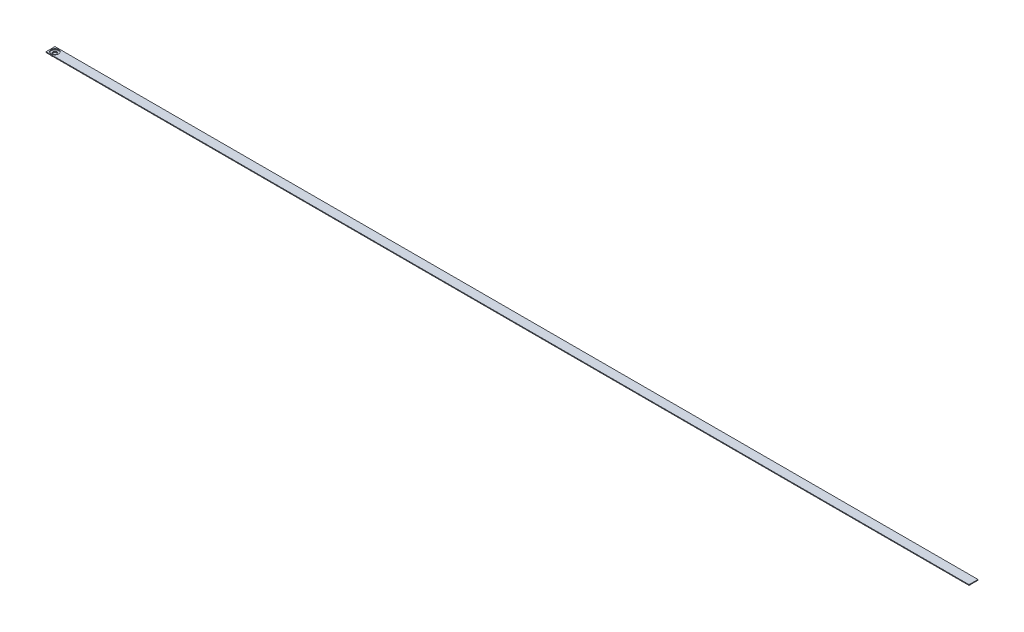
ISO-10303-21;
HEADER;
FILE_DESCRIPTION(('STEP AP214'),'2;1');
FILE_NAME('part.step','',(''),(''),'','','');
FILE_SCHEMA(('AUTOMOTIVE_DESIGN { 1 0 10303 214 1 1 1 1 }'));
ENDSEC;
DATA;
#1=APPLICATION_CONTEXT('core data for automotive mechanical design processes');
#2=APPLICATION_PROTOCOL_DEFINITION('international standard','automotive_design',2000,#1);
#3=PRODUCT_CONTEXT('',#1,'mechanical');
#4=PRODUCT('Part','Part','',(#3));
#5=PRODUCT_RELATED_PRODUCT_CATEGORY('part','',(#4));
#6=PRODUCT_DEFINITION_FORMATION('','',#4);
#7=PRODUCT_DEFINITION_CONTEXT('part definition',#1,'design');
#8=PRODUCT_DEFINITION('design','',#6,#7);
#9=PRODUCT_DEFINITION_SHAPE('','',#8);
#10=(LENGTH_UNIT() NAMED_UNIT(*) SI_UNIT(.MILLI.,.METRE.));
#11=(NAMED_UNIT(*) PLANE_ANGLE_UNIT() SI_UNIT($,.RADIAN.));
#12=(NAMED_UNIT(*) SI_UNIT($,.STERADIAN.) SOLID_ANGLE_UNIT());
#13=UNCERTAINTY_MEASURE_WITH_UNIT(LENGTH_MEASURE(1.E-05),#10,'distance_accuracy_value','');
#14=(GEOMETRIC_REPRESENTATION_CONTEXT(3) GLOBAL_UNCERTAINTY_ASSIGNED_CONTEXT((#13)) GLOBAL_UNIT_ASSIGNED_CONTEXT((#10,
#11,#12)) REPRESENTATION_CONTEXT('',''));
#15=CARTESIAN_POINT('',(0.,0.,0.));
#16=DIRECTION('',(0.,0.,1.));
#17=DIRECTION('',(1.,0.,0.));
#18=AXIS2_PLACEMENT_3D('',#15,#16,#17);
#19=CARTESIAN_POINT('',(-1213.09999999999,-4.65,0.));
#20=DIRECTION('',(0.,-1.,0.));
#21=DIRECTION('',(0.,0.,-1.));
#22=AXIS2_PLACEMENT_3D('',#19,#20,#21);
#23=CYLINDRICAL_SURFACE('',#22,5.25000000000006);
#24=CARTESIAN_POINT('',(-1213.09999999999,-4.65,0.));
#25=DIRECTION('',(0.,1.,0.));
#26=DIRECTION('',(0.,0.,1.));
#27=AXIS2_PLACEMENT_3D('',#24,#25,#26);
#28=CIRCLE('',#27,5.25000000000006);
#29=CARTESIAN_POINT('',(-1213.09999999999,-4.65,-5.25000000000006));
#30=VERTEX_POINT('',#29);
#31=EDGE_CURVE('E11',#30,#30,#28,.T.);
#32=CARTESIAN_POINT('',(-1213.09999999999,-6.55,0.));
#33=DIRECTION('',(0.,1.,0.));
#34=DIRECTION('',(0.,0.,1.));
#35=AXIS2_PLACEMENT_3D('',#32,#33,#34);
#36=CIRCLE('',#35,5.25000000000006);
#37=CARTESIAN_POINT('',(-1213.09999999999,-6.55,-5.25000000000006));
#38=VERTEX_POINT('',#37);
#39=EDGE_CURVE('E51',#38,#38,#36,.T.);
#40=CARTESIAN_POINT('',(-1213.09999999999,-4.65,-5.25000000000006));
#41=CARTESIAN_POINT('',(-1213.09999999999,-4.66979166666667,-5.25000000000006));
#42=CARTESIAN_POINT('',(-1213.09999999999,-4.68958333333333,-5.25000000000006));
#43=CARTESIAN_POINT('',(-1213.09999999999,-4.72916666666667,-5.25000000000006));
#44=CARTESIAN_POINT('',(-1213.09999999999,-4.74895833333333,-5.25000000000006));
#45=CARTESIAN_POINT('',(-1213.09999999999,-4.78854166666667,-5.25000000000006));
#46=CARTESIAN_POINT('',(-1213.09999999999,-4.80833333333333,-5.25000000000006));
#47=CARTESIAN_POINT('',(-1213.09999999999,-4.84791666666667,-5.25000000000006));
#48=CARTESIAN_POINT('',(-1213.09999999999,-4.86770833333333,-5.25000000000006));
#49=CARTESIAN_POINT('',(-1213.09999999999,-4.90729166666667,-5.25000000000006));
#50=CARTESIAN_POINT('',(-1213.09999999999,-4.92708333333333,-5.25000000000006));
#51=CARTESIAN_POINT('',(-1213.09999999999,-4.96666666666667,-5.25000000000006));
#52=CARTESIAN_POINT('',(-1213.09999999999,-4.98645833333333,-5.25000000000006));
#53=CARTESIAN_POINT('',(-1213.09999999999,-5.02604166666667,-5.25000000000006));
#54=CARTESIAN_POINT('',(-1213.09999999999,-5.04583333333333,-5.25000000000006));
#55=CARTESIAN_POINT('',(-1213.09999999999,-5.08541666666667,-5.25000000000006));
#56=CARTESIAN_POINT('',(-1213.09999999999,-5.10520833333333,-5.25000000000006));
#57=CARTESIAN_POINT('',(-1213.09999999999,-5.14479166666667,-5.25000000000006));
#58=CARTESIAN_POINT('',(-1213.09999999999,-5.16458333333333,-5.25000000000006));
#59=CARTESIAN_POINT('',(-1213.09999999999,-5.20416666666667,-5.25000000000006));
#60=CARTESIAN_POINT('',(-1213.09999999999,-5.22395833333333,-5.25000000000006));
#61=CARTESIAN_POINT('',(-1213.09999999999,-5.26354166666667,-5.25000000000006));
#62=CARTESIAN_POINT('',(-1213.09999999999,-5.28333333333333,-5.25000000000006));
#63=CARTESIAN_POINT('',(-1213.09999999999,-5.32291666666667,-5.25000000000006));
#64=CARTESIAN_POINT('',(-1213.09999999999,-5.34270833333333,-5.25000000000006));
#65=CARTESIAN_POINT('',(-1213.09999999999,-5.38229166666667,-5.25000000000006));
#66=CARTESIAN_POINT('',(-1213.09999999999,-5.40208333333333,-5.25000000000006));
#67=CARTESIAN_POINT('',(-1213.09999999999,-5.44166666666667,-5.25000000000006));
#68=CARTESIAN_POINT('',(-1213.09999999999,-5.46145833333333,-5.25000000000006));
#69=CARTESIAN_POINT('',(-1213.09999999999,-5.50104166666667,-5.25000000000006));
#70=CARTESIAN_POINT('',(-1213.09999999999,-5.52083333333333,-5.25000000000006));
#71=CARTESIAN_POINT('',(-1213.09999999999,-5.56041666666667,-5.25000000000006));
#72=CARTESIAN_POINT('',(-1213.09999999999,-5.58020833333333,-5.25000000000006));
#73=CARTESIAN_POINT('',(-1213.09999999999,-5.61979166666667,-5.25000000000006));
#74=CARTESIAN_POINT('',(-1213.09999999999,-5.63958333333333,-5.25000000000006));
#75=CARTESIAN_POINT('',(-1213.09999999999,-5.67916666666667,-5.25000000000006));
#76=CARTESIAN_POINT('',(-1213.09999999999,-5.69895833333333,-5.25000000000006));
#77=CARTESIAN_POINT('',(-1213.09999999999,-5.73854166666667,-5.25000000000006));
#78=CARTESIAN_POINT('',(-1213.09999999999,-5.75833333333333,-5.25000000000006));
#79=CARTESIAN_POINT('',(-1213.09999999999,-5.79791666666667,-5.25000000000006));
#80=CARTESIAN_POINT('',(-1213.09999999999,-5.81770833333333,-5.25000000000006));
#81=CARTESIAN_POINT('',(-1213.09999999999,-5.85729166666667,-5.25000000000006));
#82=CARTESIAN_POINT('',(-1213.09999999999,-5.87708333333333,-5.25000000000006));
#83=CARTESIAN_POINT('',(-1213.09999999999,-5.91666666666667,-5.25000000000006));
#84=CARTESIAN_POINT('',(-1213.09999999999,-5.93645833333333,-5.25000000000006));
#85=CARTESIAN_POINT('',(-1213.09999999999,-5.97604166666667,-5.25000000000006));
#86=CARTESIAN_POINT('',(-1213.09999999999,-5.99583333333333,-5.25000000000006));
#87=CARTESIAN_POINT('',(-1213.09999999999,-6.03541666666667,-5.25000000000006));
#88=CARTESIAN_POINT('',(-1213.09999999999,-6.05520833333333,-5.25000000000006));
#89=CARTESIAN_POINT('',(-1213.09999999999,-6.09479166666667,-5.25000000000006));
#90=CARTESIAN_POINT('',(-1213.09999999999,-6.11458333333333,-5.25000000000006));
#91=CARTESIAN_POINT('',(-1213.09999999999,-6.15416666666667,-5.25000000000006));
#92=CARTESIAN_POINT('',(-1213.09999999999,-6.17395833333333,-5.25000000000006));
#93=CARTESIAN_POINT('',(-1213.09999999999,-6.21354166666667,-5.25000000000006));
#94=CARTESIAN_POINT('',(-1213.09999999999,-6.23333333333333,-5.25000000000006));
#95=CARTESIAN_POINT('',(-1213.09999999999,-6.27291666666667,-5.25000000000006));
#96=CARTESIAN_POINT('',(-1213.09999999999,-6.29270833333333,-5.25000000000006));
#97=CARTESIAN_POINT('',(-1213.09999999999,-6.33229166666667,-5.25000000000006));
#98=CARTESIAN_POINT('',(-1213.09999999999,-6.35208333333333,-5.25000000000006));
#99=CARTESIAN_POINT('',(-1213.09999999999,-6.39166666666667,-5.25000000000006));
#100=CARTESIAN_POINT('',(-1213.09999999999,-6.41145833333333,-5.25000000000006));
#101=CARTESIAN_POINT('',(-1213.09999999999,-6.45104166666667,-5.25000000000006));
#102=CARTESIAN_POINT('',(-1213.09999999999,-6.47083333333333,-5.25000000000006));
#103=CARTESIAN_POINT('',(-1213.09999999999,-6.51041666666667,-5.25000000000006));
#104=CARTESIAN_POINT('',(-1213.09999999999,-6.53020833333333,-5.25000000000006));
#105=CARTESIAN_POINT('',(-1213.09999999999,-6.55,-5.25000000000006));
#106=B_SPLINE_CURVE_WITH_KNOTS('',3,(#40,#41,#42,#43,#44,#45,#46,#47,#48,#49,#50,#51,#52,#53,
#54,#55,#56,#57,#58,#59,#60,#61,#62,#63,#64,#65,#66,#67,#68,#69,#70,#71,#72,#73,#74,#75,#76,#77,
#78,#79,#80,#81,#82,#83,#84,#85,#86,#87,#88,#89,#90,#91,#92,#93,#94,#95,#96,#97,#98,#99,#100,
#101,#102,#103,#104,#105),.UNSPECIFIED.,.F.,.F.,(4,2,2,2,2,2,2,2,2,2,2,2,2,2,2,2,2,2,2,2,2,2,2,
2,2,2,2,2,2,2,2,2,4),(0.,0.0593749999999995,0.11875,0.178124999999999,0.2375,0.296874999999999,
0.35625,0.415624999999999,0.475,0.534374999999999,0.59375,0.653124999999999,0.7125,0.771875,
0.831249999999999,0.890625,0.95,1.009375,1.06875,1.128125,1.1875,1.246875,1.30625,1.365625,
1.425,1.484375,1.54375,1.603125,1.6625,1.721875,1.78125,1.840625,1.9),.UNSPECIFIED.);
#107=EDGE_CURVE('BSEAM48',#30,#38,#106,.T.);
#108=ORIENTED_EDGE('',*,*,#31,.F.);
#109=ORIENTED_EDGE('',*,*,#39,.T.);
#110=ORIENTED_EDGE('',*,*,#107,.T.);
#111=ORIENTED_EDGE('',*,*,#107,.F.);
#112=EDGE_LOOP('',(#108,#110,#109,#111));
#113=FACE_BOUND('',#112,.T.);
#114=ADVANCED_FACE('F48',(#113),#23,.T.);
#115=CARTESIAN_POINT('',(-1213.09999999999,-4.65,0.));
#116=DIRECTION('',(0.,1.,0.));
#117=DIRECTION('',(0.,0.,1.));
#118=AXIS2_PLACEMENT_3D('',#115,#116,#117);
#119=PLANE('',#118);
#120=ORIENTED_EDGE('',*,*,#31,.T.);
#121=EDGE_LOOP('',(#120));
#122=FACE_BOUND('',#121,.T.);
#123=ADVANCED_FACE('F63',(#122),#119,.T.);
#124=CARTESIAN_POINT('',(-1213.09999999999,-6.55,0.));
#125=DIRECTION('',(0.,1.,0.));
#126=DIRECTION('',(0.,0.,1.));
#127=AXIS2_PLACEMENT_3D('',#124,#125,#126);
#128=PLANE('',#127);
#129=ORIENTED_EDGE('',*,*,#39,.F.);
#130=EDGE_LOOP('',(#129));
#131=FACE_BOUND('',#130,.T.);
#132=ADVANCED_FACE('F61',(#131),#128,.F.);
#133=CLOSED_SHELL('',(#114,#123,#132));
#134=MANIFOLD_SOLID_BREP('B2',#133);
#135=CARTESIAN_POINT('',(-1213.09999999999,-1.85,0.));
#136=DIRECTION('',(0.,1.,0.));
#137=DIRECTION('',(0.,0.,1.));
#138=AXIS2_PLACEMENT_3D('',#135,#136,#137);
#139=PLANE('',#138);
#140=CARTESIAN_POINT('',(-1213.09999999999,-1.85,0.));
#141=DIRECTION('',(0.,1.,0.));
#142=DIRECTION('',(0.,0.,1.));
#143=AXIS2_PLACEMENT_3D('',#140,#141,#142);
#144=CIRCLE('',#143,10.0000000000001);
#145=CARTESIAN_POINT('',(-1213.09999999999,-1.85,-10.0000000000001));
#146=VERTEX_POINT('',#145);
#147=EDGE_CURVE('E47',#146,#146,#144,.T.);
#148=ORIENTED_EDGE('',*,*,#147,.T.);
#149=EDGE_LOOP('',(#148));
#150=FACE_BOUND('',#149,.T.);
#151=CARTESIAN_POINT('',(-1213.09999999999,-1.85,0.));
#152=DIRECTION('',(0.,1.,0.));
#153=DIRECTION('',(0.,0.,1.));
#154=AXIS2_PLACEMENT_3D('',#151,#152,#153);
#155=CIRCLE('',#154,5.25000000000005);
#156=CARTESIAN_POINT('',(-1213.09999999999,-1.85,-5.25000000000005));
#157=VERTEX_POINT('',#156);
#158=EDGE_CURVE('E109',#157,#157,#155,.T.);
#159=ORIENTED_EDGE('',*,*,#158,.F.);
#160=EDGE_LOOP('',(#159));
#161=FACE_BOUND('',#160,.T.);
#162=ADVANCED_FACE('F98',(#150,#161),#139,.T.);
#163=CARTESIAN_POINT('',(-1213.09999999999,-3.75,0.));
#164=DIRECTION('',(0.,1.,0.));
#165=DIRECTION('',(0.,0.,1.));
#166=AXIS2_PLACEMENT_3D('',#163,#164,#165);
#167=PLANE('',#166);
#168=CARTESIAN_POINT('',(-1213.09999999999,-3.75,0.));
#169=DIRECTION('',(0.,1.,0.));
#170=DIRECTION('',(0.,0.,1.));
#171=AXIS2_PLACEMENT_3D('',#168,#169,#170);
#172=CIRCLE('',#171,10.0000000000001);
#173=CARTESIAN_POINT('',(-1213.09999999999,-3.75,-10.0000000000001));
#174=VERTEX_POINT('',#173);
#175=EDGE_CURVE('E102',#174,#174,#172,.T.);
#176=ORIENTED_EDGE('',*,*,#175,.F.);
#177=EDGE_LOOP('',(#176));
#178=FACE_BOUND('',#177,.T.);
#179=CARTESIAN_POINT('',(-1213.09999999999,-3.75,0.));
#180=DIRECTION('',(0.,1.,0.));
#181=DIRECTION('',(0.,0.,1.));
#182=AXIS2_PLACEMENT_3D('',#179,#180,#181);
#183=CIRCLE('',#182,5.25000000000005);
#184=CARTESIAN_POINT('',(-1213.09999999999,-3.75,-5.25000000000005));
#185=VERTEX_POINT('',#184);
#186=EDGE_CURVE('E111',#185,#185,#183,.T.);
#187=ORIENTED_EDGE('',*,*,#186,.T.);
#188=EDGE_LOOP('',(#187));
#189=FACE_BOUND('',#188,.T.);
#190=ADVANCED_FACE('F121',(#178,#189),#167,.F.);
#191=CARTESIAN_POINT('',(-1213.09999999999,-1.85,0.));
#192=DIRECTION('',(0.,-1.,0.));
#193=DIRECTION('',(0.,0.,-1.));
#194=AXIS2_PLACEMENT_3D('',#191,#192,#193);
#195=CYLINDRICAL_SURFACE('',#194,10.0000000000001);
#196=CARTESIAN_POINT('',(-1213.09999999999,-1.85,-10.0000000000001));
#197=CARTESIAN_POINT('',(-1213.09999999999,-1.86979166666667,-10.0000000000001));
#198=CARTESIAN_POINT('',(-1213.09999999999,-1.88958333333333,-10.0000000000001));
#199=CARTESIAN_POINT('',(-1213.09999999999,-1.92916666666667,-10.0000000000001));
#200=CARTESIAN_POINT('',(-1213.09999999999,-1.94895833333333,-10.0000000000001));
#201=CARTESIAN_POINT('',(-1213.09999999999,-1.98854166666667,-10.0000000000001));
#202=CARTESIAN_POINT('',(-1213.09999999999,-2.00833333333333,-10.0000000000001));
#203=CARTESIAN_POINT('',(-1213.09999999999,-2.04791666666667,-10.0000000000001));
#204=CARTESIAN_POINT('',(-1213.09999999999,-2.06770833333333,-10.0000000000001));
#205=CARTESIAN_POINT('',(-1213.09999999999,-2.10729166666667,-10.0000000000001));
#206=CARTESIAN_POINT('',(-1213.09999999999,-2.12708333333333,-10.0000000000001));
#207=CARTESIAN_POINT('',(-1213.09999999999,-2.16666666666667,-10.0000000000001));
#208=CARTESIAN_POINT('',(-1213.09999999999,-2.18645833333333,-10.0000000000001));
#209=CARTESIAN_POINT('',(-1213.09999999999,-2.22604166666667,-10.0000000000001));
#210=CARTESIAN_POINT('',(-1213.09999999999,-2.24583333333333,-10.0000000000001));
#211=CARTESIAN_POINT('',(-1213.09999999999,-2.28541666666667,-10.0000000000001));
#212=CARTESIAN_POINT('',(-1213.09999999999,-2.30520833333333,-10.0000000000001));
#213=CARTESIAN_POINT('',(-1213.09999999999,-2.34479166666667,-10.0000000000001));
#214=CARTESIAN_POINT('',(-1213.09999999999,-2.36458333333333,-10.0000000000001));
#215=CARTESIAN_POINT('',(-1213.09999999999,-2.40416666666667,-10.0000000000001));
#216=CARTESIAN_POINT('',(-1213.09999999999,-2.42395833333333,-10.0000000000001));
#217=CARTESIAN_POINT('',(-1213.09999999999,-2.46354166666667,-10.0000000000001));
#218=CARTESIAN_POINT('',(-1213.09999999999,-2.48333333333333,-10.0000000000001));
#219=CARTESIAN_POINT('',(-1213.09999999999,-2.52291666666667,-10.0000000000001));
#220=CARTESIAN_POINT('',(-1213.09999999999,-2.54270833333333,-10.0000000000001));
#221=CARTESIAN_POINT('',(-1213.09999999999,-2.58229166666667,-10.0000000000001));
#222=CARTESIAN_POINT('',(-1213.09999999999,-2.60208333333333,-10.0000000000001));
#223=CARTESIAN_POINT('',(-1213.09999999999,-2.64166666666667,-10.0000000000001));
#224=CARTESIAN_POINT('',(-1213.09999999999,-2.66145833333333,-10.0000000000001));
#225=CARTESIAN_POINT('',(-1213.09999999999,-2.70104166666667,-10.0000000000001));
#226=CARTESIAN_POINT('',(-1213.09999999999,-2.72083333333333,-10.0000000000001));
#227=CARTESIAN_POINT('',(-1213.09999999999,-2.76041666666667,-10.0000000000001));
#228=CARTESIAN_POINT('',(-1213.09999999999,-2.78020833333333,-10.0000000000001));
#229=CARTESIAN_POINT('',(-1213.09999999999,-2.81979166666667,-10.0000000000001));
#230=CARTESIAN_POINT('',(-1213.09999999999,-2.83958333333333,-10.0000000000001));
#231=CARTESIAN_POINT('',(-1213.09999999999,-2.87916666666667,-10.0000000000001));
#232=CARTESIAN_POINT('',(-1213.09999999999,-2.89895833333333,-10.0000000000001));
#233=CARTESIAN_POINT('',(-1213.09999999999,-2.93854166666667,-10.0000000000001));
#234=CARTESIAN_POINT('',(-1213.09999999999,-2.95833333333333,-10.0000000000001));
#235=CARTESIAN_POINT('',(-1213.09999999999,-2.99791666666667,-10.0000000000001));
#236=CARTESIAN_POINT('',(-1213.09999999999,-3.01770833333333,-10.0000000000001));
#237=CARTESIAN_POINT('',(-1213.09999999999,-3.05729166666667,-10.0000000000001));
#238=CARTESIAN_POINT('',(-1213.09999999999,-3.07708333333333,-10.0000000000001));
#239=CARTESIAN_POINT('',(-1213.09999999999,-3.11666666666667,-10.0000000000001));
#240=CARTESIAN_POINT('',(-1213.09999999999,-3.13645833333333,-10.0000000000001));
#241=CARTESIAN_POINT('',(-1213.09999999999,-3.17604166666667,-10.0000000000001));
#242=CARTESIAN_POINT('',(-1213.09999999999,-3.19583333333333,-10.0000000000001));
#243=CARTESIAN_POINT('',(-1213.09999999999,-3.23541666666667,-10.0000000000001));
#244=CARTESIAN_POINT('',(-1213.09999999999,-3.25520833333333,-10.0000000000001));
#245=CARTESIAN_POINT('',(-1213.09999999999,-3.29479166666667,-10.0000000000001));
#246=CARTESIAN_POINT('',(-1213.09999999999,-3.31458333333333,-10.0000000000001));
#247=CARTESIAN_POINT('',(-1213.09999999999,-3.35416666666667,-10.0000000000001));
#248=CARTESIAN_POINT('',(-1213.09999999999,-3.37395833333333,-10.0000000000001));
#249=CARTESIAN_POINT('',(-1213.09999999999,-3.41354166666667,-10.0000000000001));
#250=CARTESIAN_POINT('',(-1213.09999999999,-3.43333333333333,-10.0000000000001));
#251=CARTESIAN_POINT('',(-1213.09999999999,-3.47291666666667,-10.0000000000001));
#252=CARTESIAN_POINT('',(-1213.09999999999,-3.49270833333333,-10.0000000000001));
#253=CARTESIAN_POINT('',(-1213.09999999999,-3.53229166666667,-10.0000000000001));
#254=CARTESIAN_POINT('',(-1213.09999999999,-3.55208333333333,-10.0000000000001));
#255=CARTESIAN_POINT('',(-1213.09999999999,-3.59166666666667,-10.0000000000001));
#256=CARTESIAN_POINT('',(-1213.09999999999,-3.61145833333333,-10.0000000000001));
#257=CARTESIAN_POINT('',(-1213.09999999999,-3.65104166666667,-10.0000000000001));
#258=CARTESIAN_POINT('',(-1213.09999999999,-3.67083333333333,-10.0000000000001));
#259=CARTESIAN_POINT('',(-1213.09999999999,-3.71041666666667,-10.0000000000001));
#260=CARTESIAN_POINT('',(-1213.09999999999,-3.73020833333333,-10.0000000000001));
#261=CARTESIAN_POINT('',(-1213.09999999999,-3.75,-10.0000000000001));
#262=B_SPLINE_CURVE_WITH_KNOTS('',3,(#196,#197,#198,#199,#200,#201,#202,#203,#204,#205,#206,
#207,#208,#209,#210,#211,#212,#213,#214,#215,#216,#217,#218,#219,#220,#221,#222,#223,#224,#225,
#226,#227,#228,#229,#230,#231,#232,#233,#234,#235,#236,#237,#238,#239,#240,#241,#242,#243,#244,
#245,#246,#247,#248,#249,#250,#251,#252,#253,#254,#255,#256,#257,#258,#259,#260,#261),
.UNSPECIFIED.,.F.,.F.,(4,2,2,2,2,2,2,2,2,2,2,2,2,2,2,2,2,2,2,2,2,2,2,2,2,2,2,2,2,2,2,2,4),(0.,
0.0593750000000002,0.11875,0.178125,0.2375,0.296875,0.35625,0.415625,0.475,0.534375,0.59375,
0.653125,0.7125,0.771875,0.83125,0.890625,0.950000000000001,1.009375,1.06875,1.128125,1.1875,
1.246875,1.30625,1.365625,1.425,1.484375,1.54375,1.603125,1.6625,1.721875,1.78125,1.840625,1.9),.UNSPECIFIED.);
#263=EDGE_CURVE('BSEAM100',#146,#174,#262,.T.);
#264=ORIENTED_EDGE('',*,*,#147,.F.);
#265=ORIENTED_EDGE('',*,*,#175,.T.);
#266=ORIENTED_EDGE('',*,*,#263,.T.);
#267=ORIENTED_EDGE('',*,*,#263,.F.);
#268=EDGE_LOOP('',(#264,#266,#265,#267));
#269=FACE_BOUND('',#268,.T.);
#270=ADVANCED_FACE('F100',(#269),#195,.T.);
#271=CARTESIAN_POINT('',(-1213.09999999999,-1.85,0.));
#272=DIRECTION('',(0.,-1.,0.));
#273=DIRECTION('',(0.,0.,-1.));
#274=AXIS2_PLACEMENT_3D('',#271,#272,#273);
#275=CYLINDRICAL_SURFACE('',#274,5.25000000000005);
#276=CARTESIAN_POINT('',(-1213.09999999999,-1.85,-5.25000000000005));
#277=CARTESIAN_POINT('',(-1213.09999999999,-1.86979166666667,-5.25000000000005));
#278=CARTESIAN_POINT('',(-1213.09999999999,-1.88958333333333,-5.25000000000005));
#279=CARTESIAN_POINT('',(-1213.09999999999,-1.92916666666667,-5.25000000000005));
#280=CARTESIAN_POINT('',(-1213.09999999999,-1.94895833333333,-5.25000000000005));
#281=CARTESIAN_POINT('',(-1213.09999999999,-1.98854166666667,-5.25000000000005));
#282=CARTESIAN_POINT('',(-1213.09999999999,-2.00833333333333,-5.25000000000005));
#283=CARTESIAN_POINT('',(-1213.09999999999,-2.04791666666667,-5.25000000000005));
#284=CARTESIAN_POINT('',(-1213.09999999999,-2.06770833333333,-5.25000000000005));
#285=CARTESIAN_POINT('',(-1213.09999999999,-2.10729166666667,-5.25000000000005));
#286=CARTESIAN_POINT('',(-1213.09999999999,-2.12708333333333,-5.25000000000005));
#287=CARTESIAN_POINT('',(-1213.09999999999,-2.16666666666667,-5.25000000000005));
#288=CARTESIAN_POINT('',(-1213.09999999999,-2.18645833333333,-5.25000000000005));
#289=CARTESIAN_POINT('',(-1213.09999999999,-2.22604166666667,-5.25000000000005));
#290=CARTESIAN_POINT('',(-1213.09999999999,-2.24583333333333,-5.25000000000005));
#291=CARTESIAN_POINT('',(-1213.09999999999,-2.28541666666667,-5.25000000000005));
#292=CARTESIAN_POINT('',(-1213.09999999999,-2.30520833333333,-5.25000000000005));
#293=CARTESIAN_POINT('',(-1213.09999999999,-2.34479166666667,-5.25000000000005));
#294=CARTESIAN_POINT('',(-1213.09999999999,-2.36458333333333,-5.25000000000005));
#295=CARTESIAN_POINT('',(-1213.09999999999,-2.40416666666667,-5.25000000000005));
#296=CARTESIAN_POINT('',(-1213.09999999999,-2.42395833333333,-5.25000000000005));
#297=CARTESIAN_POINT('',(-1213.09999999999,-2.46354166666667,-5.25000000000005));
#298=CARTESIAN_POINT('',(-1213.09999999999,-2.48333333333333,-5.25000000000005));
#299=CARTESIAN_POINT('',(-1213.09999999999,-2.52291666666667,-5.25000000000005));
#300=CARTESIAN_POINT('',(-1213.09999999999,-2.54270833333333,-5.25000000000005));
#301=CARTESIAN_POINT('',(-1213.09999999999,-2.58229166666667,-5.25000000000005));
#302=CARTESIAN_POINT('',(-1213.09999999999,-2.60208333333333,-5.25000000000005));
#303=CARTESIAN_POINT('',(-1213.09999999999,-2.64166666666667,-5.25000000000005));
#304=CARTESIAN_POINT('',(-1213.09999999999,-2.66145833333333,-5.25000000000005));
#305=CARTESIAN_POINT('',(-1213.09999999999,-2.70104166666667,-5.25000000000005));
#306=CARTESIAN_POINT('',(-1213.09999999999,-2.72083333333333,-5.25000000000005));
#307=CARTESIAN_POINT('',(-1213.09999999999,-2.76041666666667,-5.25000000000005));
#308=CARTESIAN_POINT('',(-1213.09999999999,-2.78020833333333,-5.25000000000005));
#309=CARTESIAN_POINT('',(-1213.09999999999,-2.81979166666667,-5.25000000000005));
#310=CARTESIAN_POINT('',(-1213.09999999999,-2.83958333333333,-5.25000000000005));
#311=CARTESIAN_POINT('',(-1213.09999999999,-2.87916666666667,-5.25000000000005));
#312=CARTESIAN_POINT('',(-1213.09999999999,-2.89895833333333,-5.25000000000005));
#313=CARTESIAN_POINT('',(-1213.09999999999,-2.93854166666667,-5.25000000000005));
#314=CARTESIAN_POINT('',(-1213.09999999999,-2.95833333333333,-5.25000000000005));
#315=CARTESIAN_POINT('',(-1213.09999999999,-2.99791666666667,-5.25000000000005));
#316=CARTESIAN_POINT('',(-1213.09999999999,-3.01770833333333,-5.25000000000005));
#317=CARTESIAN_POINT('',(-1213.09999999999,-3.05729166666667,-5.25000000000005));
#318=CARTESIAN_POINT('',(-1213.09999999999,-3.07708333333333,-5.25000000000005));
#319=CARTESIAN_POINT('',(-1213.09999999999,-3.11666666666667,-5.25000000000005));
#320=CARTESIAN_POINT('',(-1213.09999999999,-3.13645833333333,-5.25000000000005));
#321=CARTESIAN_POINT('',(-1213.09999999999,-3.17604166666667,-5.25000000000005));
#322=CARTESIAN_POINT('',(-1213.09999999999,-3.19583333333333,-5.25000000000005));
#323=CARTESIAN_POINT('',(-1213.09999999999,-3.23541666666667,-5.25000000000005));
#324=CARTESIAN_POINT('',(-1213.09999999999,-3.25520833333333,-5.25000000000005));
#325=CARTESIAN_POINT('',(-1213.09999999999,-3.29479166666667,-5.25000000000005));
#326=CARTESIAN_POINT('',(-1213.09999999999,-3.31458333333333,-5.25000000000005));
#327=CARTESIAN_POINT('',(-1213.09999999999,-3.35416666666667,-5.25000000000005));
#328=CARTESIAN_POINT('',(-1213.09999999999,-3.37395833333333,-5.25000000000005));
#329=CARTESIAN_POINT('',(-1213.09999999999,-3.41354166666667,-5.25000000000005));
#330=CARTESIAN_POINT('',(-1213.09999999999,-3.43333333333333,-5.25000000000005));
#331=CARTESIAN_POINT('',(-1213.09999999999,-3.47291666666667,-5.25000000000005));
#332=CARTESIAN_POINT('',(-1213.09999999999,-3.49270833333333,-5.25000000000005));
#333=CARTESIAN_POINT('',(-1213.09999999999,-3.53229166666667,-5.25000000000005));
#334=CARTESIAN_POINT('',(-1213.09999999999,-3.55208333333333,-5.25000000000005));
#335=CARTESIAN_POINT('',(-1213.09999999999,-3.59166666666667,-5.25000000000005));
#336=CARTESIAN_POINT('',(-1213.09999999999,-3.61145833333333,-5.25000000000005));
#337=CARTESIAN_POINT('',(-1213.09999999999,-3.65104166666667,-5.25000000000005));
#338=CARTESIAN_POINT('',(-1213.09999999999,-3.67083333333333,-5.25000000000005));
#339=CARTESIAN_POINT('',(-1213.09999999999,-3.71041666666667,-5.25000000000005));
#340=CARTESIAN_POINT('',(-1213.09999999999,-3.73020833333333,-5.25000000000005));
#341=CARTESIAN_POINT('',(-1213.09999999999,-3.75,-5.25000000000005));
#342=B_SPLINE_CURVE_WITH_KNOTS('',3,(#276,#277,#278,#279,#280,#281,#282,#283,#284,#285,#286,
#287,#288,#289,#290,#291,#292,#293,#294,#295,#296,#297,#298,#299,#300,#301,#302,#303,#304,#305,
#306,#307,#308,#309,#310,#311,#312,#313,#314,#315,#316,#317,#318,#319,#320,#321,#322,#323,#324,
#325,#326,#327,#328,#329,#330,#331,#332,#333,#334,#335,#336,#337,#338,#339,#340,#341),
.UNSPECIFIED.,.F.,.F.,(4,2,2,2,2,2,2,2,2,2,2,2,2,2,2,2,2,2,2,2,2,2,2,2,2,2,2,2,2,2,2,2,4),(0.,
0.0593750000000002,0.11875,0.178125,0.2375,0.296875,0.35625,0.415625,0.475,0.534375,0.59375,
0.653125,0.7125,0.771875,0.83125,0.890625,0.950000000000001,1.009375,1.06875,1.128125,1.1875,
1.246875,1.30625,1.365625,1.425,1.484375,1.54375,1.603125,1.6625,1.721875,1.78125,1.840625,1.9),.UNSPECIFIED.);
#343=EDGE_CURVE('BSEAM117',#157,#185,#342,.T.);
#344=ORIENTED_EDGE('',*,*,#158,.T.);
#345=ORIENTED_EDGE('',*,*,#186,.F.);
#346=ORIENTED_EDGE('',*,*,#343,.T.);
#347=ORIENTED_EDGE('',*,*,#343,.F.);
#348=EDGE_LOOP('',(#344,#346,#345,#347));
#349=FACE_BOUND('',#348,.T.);
#350=ADVANCED_FACE('F117',(#349),#275,.F.);
#351=CLOSED_SHELL('',(#162,#190,#270,#350));
#352=MANIFOLD_SOLID_BREP('B6',#351);
#353=CARTESIAN_POINT('',(1225.00000000001,0.95,11.9));
#354=DIRECTION('',(-1.,0.,0.));
#355=DIRECTION('',(0.,0.,1.));
#356=AXIS2_PLACEMENT_3D('',#353,#354,#355);
#357=PLANE('',#356);
#358=DIRECTION('',(0.,0.,-1.));
#359=VECTOR('',#358,1.);
#360=CARTESIAN_POINT('',(1225.00000000001,-0.95,11.9));
#361=LINE('',#360,#359);
#362=CARTESIAN_POINT('',(1225.00000000001,-0.95,11.9));
#363=VERTEX_POINT('',#362);
#364=CARTESIAN_POINT('',(1225.00000000001,-0.95,-11.9));
#365=VERTEX_POINT('',#364);
#366=EDGE_CURVE('E223',#363,#365,#361,.T.);
#367=ORIENTED_EDGE('',*,*,#366,.T.);
#368=DIRECTION('',(0.,-1.,0.));
#369=VECTOR('',#368,1.);
#370=CARTESIAN_POINT('',(1225.00000000001,0.95,-11.9));
#371=LINE('',#370,#369);
#372=CARTESIAN_POINT('',(1225.00000000001,0.95,-11.9));
#373=VERTEX_POINT('',#372);
#374=EDGE_CURVE('E96',#373,#365,#371,.T.);
#375=ORIENTED_EDGE('',*,*,#374,.F.);
#376=DIRECTION('',(0.,0.,-1.));
#377=VECTOR('',#376,1.);
#378=CARTESIAN_POINT('',(1225.00000000001,0.95,11.9));
#379=LINE('',#378,#377);
#380=CARTESIAN_POINT('',(1225.00000000001,0.95,11.9));
#381=VERTEX_POINT('',#380);
#382=EDGE_CURVE('E211',#381,#373,#379,.T.);
#383=ORIENTED_EDGE('',*,*,#382,.F.);
#384=DIRECTION('',(0.,-1.,0.));
#385=VECTOR('',#384,1.);
#386=CARTESIAN_POINT('',(1225.00000000001,0.95,11.9));
#387=LINE('',#386,#385);
#388=EDGE_CURVE('E219',#381,#363,#387,.T.);
#389=ORIENTED_EDGE('',*,*,#388,.T.);
#390=EDGE_LOOP('',(#367,#375,#383,#389));
#391=FACE_BOUND('',#390,.T.);
#392=ADVANCED_FACE('F160',(#391),#357,.F.);
#393=CARTESIAN_POINT('',(-1224.99999999999,0.95,-11.9));
#394=DIRECTION('',(0.,0.,1.));
#395=DIRECTION('',(1.,0.,0.));
#396=AXIS2_PLACEMENT_3D('',#393,#394,#395);
#397=PLANE('',#396);
#398=DIRECTION('',(-1.,0.,0.));
#399=VECTOR('',#398,1.);
#400=CARTESIAN_POINT('',(-1224.99999999999,-0.95,-11.9));
#401=LINE('',#400,#399);
#402=CARTESIAN_POINT('',(-1224.99999999999,-0.95,-11.9));
#403=VERTEX_POINT('',#402);
#404=EDGE_CURVE('E215',#365,#403,#401,.T.);
#405=ORIENTED_EDGE('',*,*,#404,.T.);
#406=DIRECTION('',(0.,-1.,0.));
#407=VECTOR('',#406,1.);
#408=CARTESIAN_POINT('',(-1224.99999999999,0.95,-11.9));
#409=LINE('',#408,#407);
#410=CARTESIAN_POINT('',(-1224.99999999999,0.95,-11.9));
#411=VERTEX_POINT('',#410);
#412=EDGE_CURVE('E168',#411,#403,#409,.T.);
#413=ORIENTED_EDGE('',*,*,#412,.F.);
#414=DIRECTION('',(-1.,0.,0.));
#415=VECTOR('',#414,1.);
#416=CARTESIAN_POINT('',(-1224.99999999999,0.95,-11.9));
#417=LINE('',#416,#415);
#418=EDGE_CURVE('E206',#373,#411,#417,.T.);
#419=ORIENTED_EDGE('',*,*,#418,.F.);
#420=ORIENTED_EDGE('',*,*,#374,.T.);
#421=EDGE_LOOP('',(#405,#413,#419,#420));
#422=FACE_BOUND('',#421,.T.);
#423=ADVANCED_FACE('F214',(#422),#397,.F.);
#424=CARTESIAN_POINT('',(-1224.99999999999,0.95,11.9));
#425=DIRECTION('',(1.,0.,0.));
#426=DIRECTION('',(0.,0.,-1.));
#427=AXIS2_PLACEMENT_3D('',#424,#425,#426);
#428=PLANE('',#427);
#429=DIRECTION('',(0.,0.,1.));
#430=VECTOR('',#429,1.);
#431=CARTESIAN_POINT('',(-1224.99999999999,-0.95,11.9));
#432=LINE('',#431,#430);
#433=CARTESIAN_POINT('',(-1224.99999999999,-0.95,11.9));
#434=VERTEX_POINT('',#433);
#435=EDGE_CURVE('E193',#403,#434,#432,.T.);
#436=ORIENTED_EDGE('',*,*,#435,.T.);
#437=DIRECTION('',(0.,-1.,0.));
#438=VECTOR('',#437,1.);
#439=CARTESIAN_POINT('',(-1224.99999999999,0.95,11.9));
#440=LINE('',#439,#438);
#441=CARTESIAN_POINT('',(-1224.99999999999,0.95,11.9));
#442=VERTEX_POINT('',#441);
#443=EDGE_CURVE('E216',#442,#434,#440,.T.);
#444=ORIENTED_EDGE('',*,*,#443,.F.);
#445=DIRECTION('',(0.,0.,1.));
#446=VECTOR('',#445,1.);
#447=CARTESIAN_POINT('',(-1224.99999999999,0.95,11.9));
#448=LINE('',#447,#446);
#449=EDGE_CURVE('E209',#411,#442,#448,.T.);
#450=ORIENTED_EDGE('',*,*,#449,.F.);
#451=ORIENTED_EDGE('',*,*,#412,.T.);
#452=EDGE_LOOP('',(#436,#444,#450,#451));
#453=FACE_BOUND('',#452,.T.);
#454=ADVANCED_FACE('F217',(#453),#428,.F.);
#455=CARTESIAN_POINT('',(-1224.99999999999,0.95,11.9));
#456=DIRECTION('',(0.,0.,-1.));
#457=DIRECTION('',(-1.,0.,0.));
#458=AXIS2_PLACEMENT_3D('',#455,#456,#457);
#459=PLANE('',#458);
#460=DIRECTION('',(1.,0.,0.));
#461=VECTOR('',#460,1.);
#462=CARTESIAN_POINT('',(-1224.99999999999,-0.95,11.9));
#463=LINE('',#462,#461);
#464=EDGE_CURVE('E199',#434,#363,#463,.T.);
#465=ORIENTED_EDGE('',*,*,#464,.T.);
#466=ORIENTED_EDGE('',*,*,#388,.F.);
#467=DIRECTION('',(1.,0.,0.));
#468=VECTOR('',#467,1.);
#469=CARTESIAN_POINT('',(-1224.99999999999,0.95,11.9));
#470=LINE('',#469,#468);
#471=EDGE_CURVE('E176',#442,#381,#470,.T.);
#472=ORIENTED_EDGE('',*,*,#471,.F.);
#473=ORIENTED_EDGE('',*,*,#443,.T.);
#474=EDGE_LOOP('',(#465,#466,#472,#473));
#475=FACE_BOUND('',#474,.T.);
#476=ADVANCED_FACE('F231',(#475),#459,.F.);
#477=CARTESIAN_POINT('',(0.,0.95,0.));
#478=DIRECTION('',(0.,-1.,0.));
#479=DIRECTION('',(0.,0.,-1.));
#480=AXIS2_PLACEMENT_3D('',#477,#478,#479);
#481=PLANE('',#480);
#482=CARTESIAN_POINT('',(-1213.09999999999,0.95,0.));
#483=DIRECTION('',(0.,1.,0.));
#484=DIRECTION('',(0.,0.,1.));
#485=AXIS2_PLACEMENT_3D('',#482,#483,#484);
#486=CIRCLE('',#485,10.0000000000001);
#487=CARTESIAN_POINT('',(-1213.09999999999,0.95,10.0000000000001));
#488=VERTEX_POINT('',#487);
#489=EDGE_CURVE('E226',#488,#488,#486,.T.);
#490=ORIENTED_EDGE('',*,*,#489,.F.);
#491=EDGE_LOOP('',(#490));
#492=FACE_BOUND('',#491,.T.);
#493=ORIENTED_EDGE('',*,*,#382,.T.);
#494=ORIENTED_EDGE('',*,*,#418,.T.);
#495=ORIENTED_EDGE('',*,*,#449,.T.);
#496=ORIENTED_EDGE('',*,*,#471,.T.);
#497=EDGE_LOOP('',(#493,#494,#495,#496));
#498=FACE_BOUND('',#497,.T.);
#499=ADVANCED_FACE('F207',(#492,#498),#481,.F.);
#500=CARTESIAN_POINT('',(0.,-0.95,0.));
#501=DIRECTION('',(0.,-1.,0.));
#502=DIRECTION('',(0.,0.,-1.));
#503=AXIS2_PLACEMENT_3D('',#500,#501,#502);
#504=PLANE('',#503);
#505=CARTESIAN_POINT('',(-1213.09999999999,-0.95,0.));
#506=DIRECTION('',(0.,-1.,0.));
#507=DIRECTION('',(0.,0.,-1.));
#508=AXIS2_PLACEMENT_3D('',#505,#506,#507);
#509=CIRCLE('',#508,10.0000000000001);
#510=CARTESIAN_POINT('',(-1213.09999999999,-0.95,-10.0000000000001));
#511=VERTEX_POINT('',#510);
#512=EDGE_CURVE('E237',#511,#511,#509,.F.);
#513=ORIENTED_EDGE('',*,*,#512,.T.);
#514=EDGE_LOOP('',(#513));
#515=FACE_BOUND('',#514,.T.);
#516=ORIENTED_EDGE('',*,*,#366,.F.);
#517=ORIENTED_EDGE('',*,*,#464,.F.);
#518=ORIENTED_EDGE('',*,*,#435,.F.);
#519=ORIENTED_EDGE('',*,*,#404,.F.);
#520=EDGE_LOOP('',(#516,#517,#518,#519));
#521=FACE_BOUND('',#520,.T.);
#522=ADVANCED_FACE('F234',(#515,#521),#504,.T.);
#523=CARTESIAN_POINT('',(-1213.09999999999,-0.951,0.));
#524=DIRECTION('',(0.,1.,0.));
#525=DIRECTION('',(0.,0.,1.));
#526=AXIS2_PLACEMENT_3D('',#523,#524,#525);
#527=CYLINDRICAL_SURFACE('',#526,10.0000000000001);
#528=ORIENTED_EDGE('',*,*,#512,.F.);
#529=EDGE_LOOP('',(#528));
#530=FACE_BOUND('',#529,.T.);
#531=ORIENTED_EDGE('',*,*,#489,.T.);
#532=EDGE_LOOP('',(#531));
#533=FACE_BOUND('',#532,.T.);
#534=ADVANCED_FACE('F243',(#530,#533),#527,.F.);
#535=CLOSED_SHELL('',(#392,#423,#454,#476,#499,#522,#534));
#536=MANIFOLD_SOLID_BREP('B42',#535);
#537=ADVANCED_BREP_SHAPE_REPRESENTATION('',(#18,#134,#352,#536),#14);
#538=SHAPE_DEFINITION_REPRESENTATION(#9,#537);
ENDSEC;
END-ISO-10303-21;
